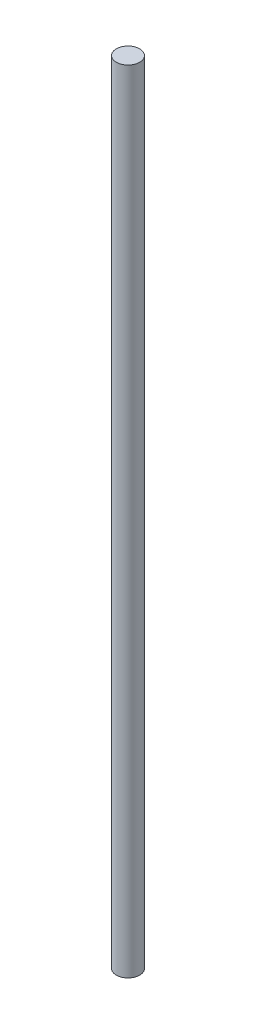
ISO-10303-21;
HEADER;
FILE_DESCRIPTION(('STEP AP214'),'2;1');
FILE_NAME('part.step','',(''),(''),'','','');
FILE_SCHEMA(('AUTOMOTIVE_DESIGN { 1 0 10303 214 1 1 1 1 }'));
ENDSEC;
DATA;
#1=APPLICATION_CONTEXT('core data for automotive mechanical design processes');
#2=APPLICATION_PROTOCOL_DEFINITION('international standard','automotive_design',2000,#1);
#3=PRODUCT_CONTEXT('',#1,'mechanical');
#4=PRODUCT('Part','Part','',(#3));
#5=PRODUCT_RELATED_PRODUCT_CATEGORY('part','',(#4));
#6=PRODUCT_DEFINITION_FORMATION('','',#4);
#7=PRODUCT_DEFINITION_CONTEXT('part definition',#1,'design');
#8=PRODUCT_DEFINITION('design','',#6,#7);
#9=PRODUCT_DEFINITION_SHAPE('','',#8);
#10=(LENGTH_UNIT() NAMED_UNIT(*) SI_UNIT(.MILLI.,.METRE.));
#11=(NAMED_UNIT(*) PLANE_ANGLE_UNIT() SI_UNIT($,.RADIAN.));
#12=(NAMED_UNIT(*) SI_UNIT($,.STERADIAN.) SOLID_ANGLE_UNIT());
#13=UNCERTAINTY_MEASURE_WITH_UNIT(LENGTH_MEASURE(1.E-05),#10,'distance_accuracy_value','');
#14=(GEOMETRIC_REPRESENTATION_CONTEXT(3) GLOBAL_UNCERTAINTY_ASSIGNED_CONTEXT((#13)) GLOBAL_UNIT_ASSIGNED_CONTEXT((#10,
#11,#12)) REPRESENTATION_CONTEXT('',''));
#15=CARTESIAN_POINT('',(0.,0.,0.));
#16=DIRECTION('',(0.,0.,1.));
#17=DIRECTION('',(1.,0.,0.));
#18=AXIS2_PLACEMENT_3D('',#15,#16,#17);
#19=CARTESIAN_POINT('',(0.,105.,0.));
#20=DIRECTION('',(0.,-1.,0.));
#21=DIRECTION('',(0.,0.,-1.));
#22=AXIS2_PLACEMENT_3D('',#19,#20,#21);
#23=CYLINDRICAL_SURFACE('',#22,1.55);
#24=CARTESIAN_POINT('',(0.,105.,0.));
#25=DIRECTION('',(0.,1.,0.));
#26=DIRECTION('',(0.,0.,1.));
#27=AXIS2_PLACEMENT_3D('',#24,#25,#26);
#28=CIRCLE('',#27,1.55);
#29=CARTESIAN_POINT('',(0.,105.,1.55));
#30=VERTEX_POINT('',#29);
#31=EDGE_CURVE('E10',#30,#30,#28,.T.);
#32=ORIENTED_EDGE('',*,*,#31,.F.);
#33=EDGE_LOOP('',(#32));
#34=FACE_BOUND('',#33,.T.);
#35=CARTESIAN_POINT('',(0.,0.,0.));
#36=DIRECTION('',(0.,1.,0.));
#37=DIRECTION('',(0.,0.,1.));
#38=AXIS2_PLACEMENT_3D('',#35,#36,#37);
#39=CIRCLE('',#38,1.55);
#40=CARTESIAN_POINT('',(0.,0.,1.55));
#41=VERTEX_POINT('',#40);
#42=EDGE_CURVE('E35',#41,#41,#39,.T.);
#43=ORIENTED_EDGE('',*,*,#42,.T.);
#44=EDGE_LOOP('',(#43));
#45=FACE_BOUND('',#44,.T.);
#46=ADVANCED_FACE('F32',(#34,#45),#23,.T.);
#47=CARTESIAN_POINT('',(0.,105.,0.));
#48=DIRECTION('',(0.,1.,0.));
#49=DIRECTION('',(0.,0.,1.));
#50=AXIS2_PLACEMENT_3D('',#47,#48,#49);
#51=PLANE('',#50);
#52=ORIENTED_EDGE('',*,*,#31,.T.);
#53=EDGE_LOOP('',(#52));
#54=FACE_BOUND('',#53,.T.);
#55=ADVANCED_FACE('F47',(#54),#51,.T.);
#56=CARTESIAN_POINT('',(0.,0.,0.));
#57=DIRECTION('',(0.,1.,0.));
#58=DIRECTION('',(0.,0.,1.));
#59=AXIS2_PLACEMENT_3D('',#56,#57,#58);
#60=PLANE('',#59);
#61=ORIENTED_EDGE('',*,*,#42,.F.);
#62=EDGE_LOOP('',(#61));
#63=FACE_BOUND('',#62,.T.);
#64=ADVANCED_FACE('F45',(#63),#60,.F.);
#65=CLOSED_SHELL('',(#46,#55,#64));
#66=MANIFOLD_SOLID_BREP('B2',#65);
#67=ADVANCED_BREP_SHAPE_REPRESENTATION('',(#18,#66),#14);
#68=SHAPE_DEFINITION_REPRESENTATION(#9,#67);
ENDSEC;
END-ISO-10303-21;
